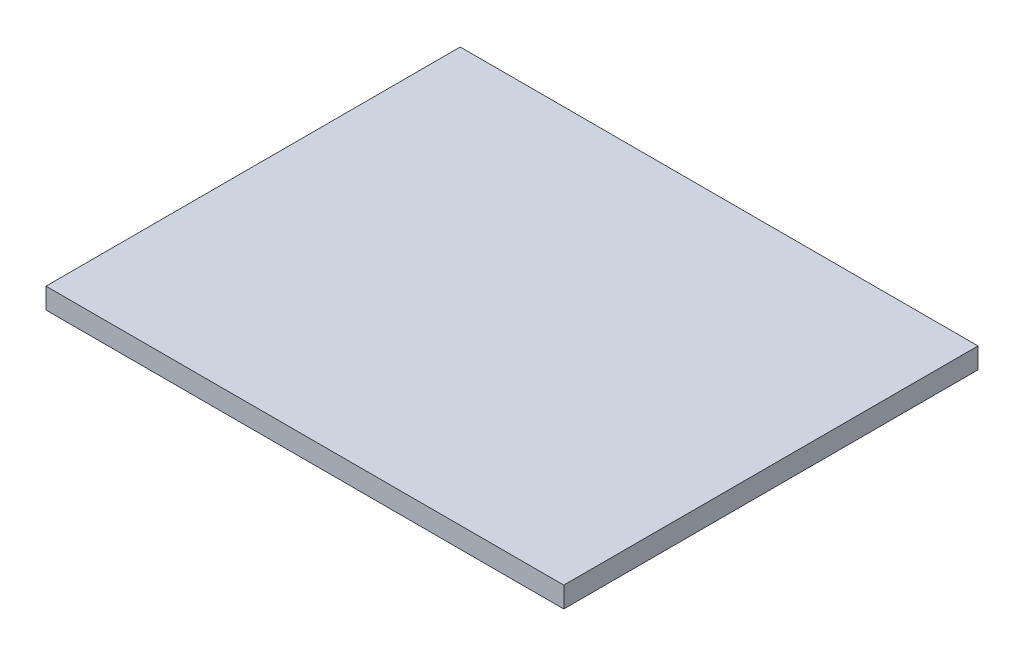
ISO-10303-21;
HEADER;
FILE_DESCRIPTION(('STEP AP214'),'2;1');
FILE_NAME('part.step','',(''),(''),'','','');
FILE_SCHEMA(('AUTOMOTIVE_DESIGN { 1 0 10303 214 1 1 1 1 }'));
ENDSEC;
DATA;
#1=APPLICATION_CONTEXT('core data for automotive mechanical design processes');
#2=APPLICATION_PROTOCOL_DEFINITION('international standard','automotive_design',2000,#1);
#3=PRODUCT_CONTEXT('',#1,'mechanical');
#4=PRODUCT('Part','Part','',(#3));
#5=PRODUCT_RELATED_PRODUCT_CATEGORY('part','',(#4));
#6=PRODUCT_DEFINITION_FORMATION('','',#4);
#7=PRODUCT_DEFINITION_CONTEXT('part definition',#1,'design');
#8=PRODUCT_DEFINITION('design','',#6,#7);
#9=PRODUCT_DEFINITION_SHAPE('','',#8);
#10=(LENGTH_UNIT() NAMED_UNIT(*) SI_UNIT(.MILLI.,.METRE.));
#11=(NAMED_UNIT(*) PLANE_ANGLE_UNIT() SI_UNIT($,.RADIAN.));
#12=(NAMED_UNIT(*) SI_UNIT($,.STERADIAN.) SOLID_ANGLE_UNIT());
#13=UNCERTAINTY_MEASURE_WITH_UNIT(LENGTH_MEASURE(1.E-05),#10,'distance_accuracy_value','');
#14=(GEOMETRIC_REPRESENTATION_CONTEXT(3) GLOBAL_UNCERTAINTY_ASSIGNED_CONTEXT((#13)) GLOBAL_UNIT_ASSIGNED_CONTEXT((#10,
#11,#12)) REPRESENTATION_CONTEXT('',''));
#15=CARTESIAN_POINT('',(0.,0.,0.));
#16=DIRECTION('',(0.,0.,1.));
#17=DIRECTION('',(1.,0.,0.));
#18=AXIS2_PLACEMENT_3D('',#15,#16,#17);
#19=CARTESIAN_POINT('',(250.,20.,-200.));
#20=DIRECTION('',(-1.,0.,0.));
#21=DIRECTION('',(0.,0.,1.));
#22=AXIS2_PLACEMENT_3D('',#19,#20,#21);
#23=PLANE('',#22);
#24=DIRECTION('',(0.,0.,-1.));
#25=VECTOR('',#24,1.);
#26=CARTESIAN_POINT('',(250.,0.,-200.));
#27=LINE('',#26,#25);
#28=CARTESIAN_POINT('',(250.,0.,200.));
#29=VERTEX_POINT('',#28);
#30=CARTESIAN_POINT('',(250.,0.,-200.));
#31=VERTEX_POINT('',#30);
#32=EDGE_CURVE('E96',#29,#31,#27,.T.);
#33=ORIENTED_EDGE('',*,*,#32,.T.);
#34=DIRECTION('',(0.,-1.,0.));
#35=VECTOR('',#34,1.);
#36=CARTESIAN_POINT('',(250.,20.,-200.));
#37=LINE('',#36,#35);
#38=CARTESIAN_POINT('',(250.,20.,-200.));
#39=VERTEX_POINT('',#38);
#40=EDGE_CURVE('E11',#39,#31,#37,.T.);
#41=ORIENTED_EDGE('',*,*,#40,.F.);
#42=DIRECTION('',(0.,0.,-1.));
#43=VECTOR('',#42,1.);
#44=CARTESIAN_POINT('',(250.,20.,-200.));
#45=LINE('',#44,#43);
#46=CARTESIAN_POINT('',(250.,20.,200.));
#47=VERTEX_POINT('',#46);
#48=EDGE_CURVE('E84',#47,#39,#45,.T.);
#49=ORIENTED_EDGE('',*,*,#48,.F.);
#50=DIRECTION('',(0.,-1.,0.));
#51=VECTOR('',#50,1.);
#52=CARTESIAN_POINT('',(250.,20.,200.));
#53=LINE('',#52,#51);
#54=EDGE_CURVE('E92',#47,#29,#53,.T.);
#55=ORIENTED_EDGE('',*,*,#54,.T.);
#56=EDGE_LOOP('',(#33,#41,#49,#55));
#57=FACE_BOUND('',#56,.T.);
#58=ADVANCED_FACE('F33',(#57),#23,.F.);
#59=CARTESIAN_POINT('',(-250.,20.,-200.));
#60=DIRECTION('',(0.,0.,1.));
#61=DIRECTION('',(1.,0.,0.));
#62=AXIS2_PLACEMENT_3D('',#59,#60,#61);
#63=PLANE('',#62);
#64=DIRECTION('',(-1.,0.,0.));
#65=VECTOR('',#64,1.);
#66=CARTESIAN_POINT('',(-250.,0.,-200.));
#67=LINE('',#66,#65);
#68=CARTESIAN_POINT('',(-250.,0.,-200.));
#69=VERTEX_POINT('',#68);
#70=EDGE_CURVE('E88',#31,#69,#67,.T.);
#71=ORIENTED_EDGE('',*,*,#70,.T.);
#72=DIRECTION('',(0.,-1.,0.));
#73=VECTOR('',#72,1.);
#74=CARTESIAN_POINT('',(-250.,20.,-200.));
#75=LINE('',#74,#73);
#76=CARTESIAN_POINT('',(-250.,20.,-200.));
#77=VERTEX_POINT('',#76);
#78=EDGE_CURVE('E41',#77,#69,#75,.T.);
#79=ORIENTED_EDGE('',*,*,#78,.F.);
#80=DIRECTION('',(-1.,0.,0.));
#81=VECTOR('',#80,1.);
#82=CARTESIAN_POINT('',(-250.,20.,-200.));
#83=LINE('',#82,#81);
#84=EDGE_CURVE('E79',#39,#77,#83,.T.);
#85=ORIENTED_EDGE('',*,*,#84,.F.);
#86=ORIENTED_EDGE('',*,*,#40,.T.);
#87=EDGE_LOOP('',(#71,#79,#85,#86));
#88=FACE_BOUND('',#87,.T.);
#89=ADVANCED_FACE('F87',(#88),#63,.F.);
#90=CARTESIAN_POINT('',(-250.,20.,-200.));
#91=DIRECTION('',(1.,0.,0.));
#92=DIRECTION('',(0.,0.,-1.));
#93=AXIS2_PLACEMENT_3D('',#90,#91,#92);
#94=PLANE('',#93);
#95=DIRECTION('',(0.,0.,1.));
#96=VECTOR('',#95,1.);
#97=CARTESIAN_POINT('',(-250.,0.,-200.));
#98=LINE('',#97,#96);
#99=CARTESIAN_POINT('',(-250.,0.,200.));
#100=VERTEX_POINT('',#99);
#101=EDGE_CURVE('E66',#69,#100,#98,.T.);
#102=ORIENTED_EDGE('',*,*,#101,.T.);
#103=DIRECTION('',(0.,-1.,0.));
#104=VECTOR('',#103,1.);
#105=CARTESIAN_POINT('',(-250.,20.,200.));
#106=LINE('',#105,#104);
#107=CARTESIAN_POINT('',(-250.,20.,200.));
#108=VERTEX_POINT('',#107);
#109=EDGE_CURVE('E89',#108,#100,#106,.T.);
#110=ORIENTED_EDGE('',*,*,#109,.F.);
#111=DIRECTION('',(0.,0.,1.));
#112=VECTOR('',#111,1.);
#113=CARTESIAN_POINT('',(-250.,20.,-200.));
#114=LINE('',#113,#112);
#115=EDGE_CURVE('E82',#77,#108,#114,.T.);
#116=ORIENTED_EDGE('',*,*,#115,.F.);
#117=ORIENTED_EDGE('',*,*,#78,.T.);
#118=EDGE_LOOP('',(#102,#110,#116,#117));
#119=FACE_BOUND('',#118,.T.);
#120=ADVANCED_FACE('F90',(#119),#94,.F.);
#121=CARTESIAN_POINT('',(-250.,20.,200.));
#122=DIRECTION('',(0.,0.,-1.));
#123=DIRECTION('',(-1.,0.,0.));
#124=AXIS2_PLACEMENT_3D('',#121,#122,#123);
#125=PLANE('',#124);
#126=DIRECTION('',(1.,0.,0.));
#127=VECTOR('',#126,1.);
#128=CARTESIAN_POINT('',(-250.,0.,200.));
#129=LINE('',#128,#127);
#130=EDGE_CURVE('E72',#100,#29,#129,.T.);
#131=ORIENTED_EDGE('',*,*,#130,.T.);
#132=ORIENTED_EDGE('',*,*,#54,.F.);
#133=DIRECTION('',(1.,0.,0.));
#134=VECTOR('',#133,1.);
#135=CARTESIAN_POINT('',(-250.,20.,200.));
#136=LINE('',#135,#134);
#137=EDGE_CURVE('E49',#108,#47,#136,.T.);
#138=ORIENTED_EDGE('',*,*,#137,.F.);
#139=ORIENTED_EDGE('',*,*,#109,.T.);
#140=EDGE_LOOP('',(#131,#132,#138,#139));
#141=FACE_BOUND('',#140,.T.);
#142=ADVANCED_FACE('F103',(#141),#125,.F.);
#143=CARTESIAN_POINT('',(0.,20.,0.));
#144=DIRECTION('',(0.,1.,0.));
#145=DIRECTION('',(0.,0.,1.));
#146=AXIS2_PLACEMENT_3D('',#143,#144,#145);
#147=PLANE('',#146);
#148=ORIENTED_EDGE('',*,*,#48,.T.);
#149=ORIENTED_EDGE('',*,*,#84,.T.);
#150=ORIENTED_EDGE('',*,*,#115,.T.);
#151=ORIENTED_EDGE('',*,*,#137,.T.);
#152=EDGE_LOOP('',(#148,#149,#150,#151));
#153=FACE_BOUND('',#152,.T.);
#154=ADVANCED_FACE('F80',(#153),#147,.T.);
#155=CARTESIAN_POINT('',(0.,0.,0.));
#156=DIRECTION('',(0.,1.,0.));
#157=DIRECTION('',(0.,0.,1.));
#158=AXIS2_PLACEMENT_3D('',#155,#156,#157);
#159=PLANE('',#158);
#160=ORIENTED_EDGE('',*,*,#32,.F.);
#161=ORIENTED_EDGE('',*,*,#130,.F.);
#162=ORIENTED_EDGE('',*,*,#101,.F.);
#163=ORIENTED_EDGE('',*,*,#70,.F.);
#164=EDGE_LOOP('',(#160,#161,#162,#163));
#165=FACE_BOUND('',#164,.T.);
#166=ADVANCED_FACE('F106',(#165),#159,.F.);
#167=CLOSED_SHELL('',(#58,#89,#120,#142,#154,#166));
#168=MANIFOLD_SOLID_BREP('B2',#167);
#169=ADVANCED_BREP_SHAPE_REPRESENTATION('',(#18,#168),#14);
#170=SHAPE_DEFINITION_REPRESENTATION(#9,#169);
ENDSEC;
END-ISO-10303-21;
